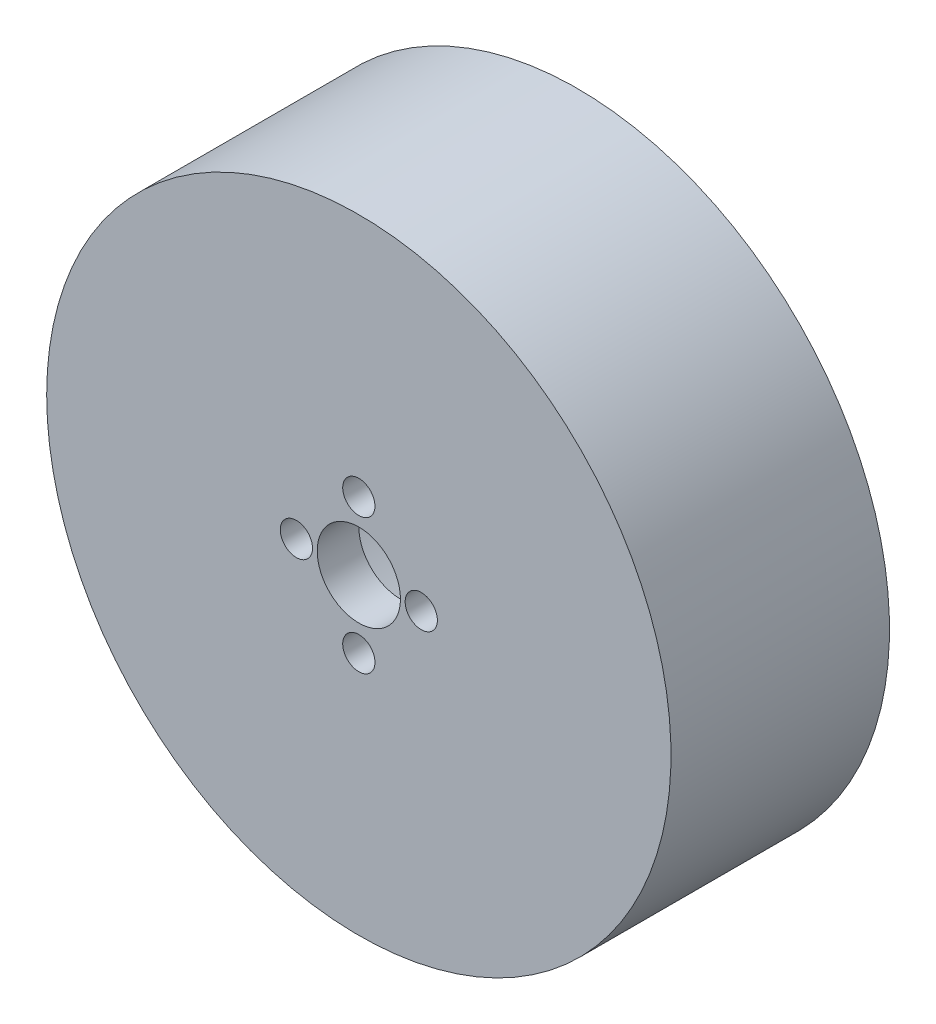
ISO-10303-21;
HEADER;
FILE_DESCRIPTION(('STEP AP214'),'2;1');
FILE_NAME('part.step','',(''),(''),'','','');
FILE_SCHEMA(('AUTOMOTIVE_DESIGN { 1 0 10303 214 1 1 1 1 }'));
ENDSEC;
DATA;
#1=APPLICATION_CONTEXT('core data for automotive mechanical design processes');
#2=APPLICATION_PROTOCOL_DEFINITION('international standard','automotive_design',2000,#1);
#3=PRODUCT_CONTEXT('',#1,'mechanical');
#4=PRODUCT('Part','Part','',(#3));
#5=PRODUCT_RELATED_PRODUCT_CATEGORY('part','',(#4));
#6=PRODUCT_DEFINITION_FORMATION('','',#4);
#7=PRODUCT_DEFINITION_CONTEXT('part definition',#1,'design');
#8=PRODUCT_DEFINITION('design','',#6,#7);
#9=PRODUCT_DEFINITION_SHAPE('','',#8);
#10=(LENGTH_UNIT() NAMED_UNIT(*) SI_UNIT(.MILLI.,.METRE.));
#11=(NAMED_UNIT(*) PLANE_ANGLE_UNIT() SI_UNIT($,.RADIAN.));
#12=(NAMED_UNIT(*) SI_UNIT($,.STERADIAN.) SOLID_ANGLE_UNIT());
#13=UNCERTAINTY_MEASURE_WITH_UNIT(LENGTH_MEASURE(1.E-05),#10,'distance_accuracy_value','');
#14=(GEOMETRIC_REPRESENTATION_CONTEXT(3) GLOBAL_UNCERTAINTY_ASSIGNED_CONTEXT((#13)) GLOBAL_UNIT_ASSIGNED_CONTEXT((#10,
#11,#12)) REPRESENTATION_CONTEXT('',''));
#15=CARTESIAN_POINT('',(0.,0.,0.));
#16=DIRECTION('',(0.,0.,1.));
#17=DIRECTION('',(1.,0.,0.));
#18=AXIS2_PLACEMENT_3D('',#15,#16,#17);
#19=CARTESIAN_POINT('',(0.,0.,0.5));
#20=DIRECTION('',(0.,0.,1.));
#21=DIRECTION('',(1.,0.,0.));
#22=AXIS2_PLACEMENT_3D('',#19,#20,#21);
#23=CYLINDRICAL_SURFACE('',#22,4.);
#24=CARTESIAN_POINT('',(0.,0.,10.5));
#25=DIRECTION('',(0.,0.,1.));
#26=DIRECTION('',(1.,0.,0.));
#27=AXIS2_PLACEMENT_3D('',#24,#25,#26);
#28=CIRCLE('',#27,4.);
#29=CARTESIAN_POINT('',(4.,0.,10.5));
#30=VERTEX_POINT('',#29);
#31=EDGE_CURVE('E58',#30,#30,#28,.T.);
#32=ORIENTED_EDGE('',*,*,#31,.T.);
#33=EDGE_LOOP('',(#32));
#34=FACE_BOUND('',#33,.T.);
#35=CARTESIAN_POINT('',(0.,0.,6.5));
#36=DIRECTION('',(0.,0.,-1.));
#37=DIRECTION('',(-1.,0.,0.));
#38=AXIS2_PLACEMENT_3D('',#35,#36,#37);
#39=CIRCLE('',#38,4.);
#40=CARTESIAN_POINT('',(-4.,0.,6.5));
#41=VERTEX_POINT('',#40);
#42=EDGE_CURVE('E76',#41,#41,#39,.F.);
#43=ORIENTED_EDGE('',*,*,#42,.F.);
#44=EDGE_LOOP('',(#43));
#45=FACE_BOUND('',#44,.T.);
#46=ADVANCED_FACE('F43',(#34,#45),#23,.F.);
#47=CARTESIAN_POINT('',(0.,-6.5,0.5));
#48=DIRECTION('',(0.,0.,1.));
#49=DIRECTION('',(1.,0.,0.));
#50=AXIS2_PLACEMENT_3D('',#47,#48,#49);
#51=CYLINDRICAL_SURFACE('',#50,1.55);
#52=CARTESIAN_POINT('',(0.,-6.5,10.5));
#53=DIRECTION('',(0.,0.,1.));
#54=DIRECTION('',(1.,0.,0.));
#55=AXIS2_PLACEMENT_3D('',#52,#53,#54);
#56=CIRCLE('',#55,1.55);
#57=CARTESIAN_POINT('',(1.55,-6.5,10.5));
#58=VERTEX_POINT('',#57);
#59=EDGE_CURVE('E72',#58,#58,#56,.T.);
#60=ORIENTED_EDGE('',*,*,#59,.T.);
#61=EDGE_LOOP('',(#60));
#62=FACE_BOUND('',#61,.T.);
#63=CARTESIAN_POINT('',(0.,-6.5,6.5));
#64=DIRECTION('',(0.,0.,-1.));
#65=DIRECTION('',(-1.,0.,0.));
#66=AXIS2_PLACEMENT_3D('',#63,#64,#65);
#67=CIRCLE('',#66,1.55);
#68=CARTESIAN_POINT('',(-1.55,-6.5,6.5));
#69=VERTEX_POINT('',#68);
#70=EDGE_CURVE('E83',#69,#69,#67,.F.);
#71=ORIENTED_EDGE('',*,*,#70,.F.);
#72=EDGE_LOOP('',(#71));
#73=FACE_BOUND('',#72,.T.);
#74=ADVANCED_FACE('F128',(#62,#73),#51,.F.);
#75=CARTESIAN_POINT('',(6.,0.,0.5));
#76=DIRECTION('',(0.,0.,1.));
#77=DIRECTION('',(1.,0.,0.));
#78=AXIS2_PLACEMENT_3D('',#75,#76,#77);
#79=CYLINDRICAL_SURFACE('',#78,1.55);
#80=CARTESIAN_POINT('',(6.,0.,10.5));
#81=DIRECTION('',(0.,0.,1.));
#82=DIRECTION('',(1.,0.,0.));
#83=AXIS2_PLACEMENT_3D('',#80,#81,#82);
#84=CIRCLE('',#83,1.55);
#85=CARTESIAN_POINT('',(7.55,0.,10.5));
#86=VERTEX_POINT('',#85);
#87=EDGE_CURVE('E68',#86,#86,#84,.T.);
#88=ORIENTED_EDGE('',*,*,#87,.T.);
#89=EDGE_LOOP('',(#88));
#90=FACE_BOUND('',#89,.T.);
#91=CARTESIAN_POINT('',(6.,0.,6.5));
#92=DIRECTION('',(0.,0.,-1.));
#93=DIRECTION('',(-1.,0.,0.));
#94=AXIS2_PLACEMENT_3D('',#91,#92,#93);
#95=CIRCLE('',#94,1.55);
#96=CARTESIAN_POINT('',(4.45,0.,6.5));
#97=VERTEX_POINT('',#96);
#98=EDGE_CURVE('E87',#97,#97,#95,.F.);
#99=ORIENTED_EDGE('',*,*,#98,.F.);
#100=EDGE_LOOP('',(#99));
#101=FACE_BOUND('',#100,.T.);
#102=ADVANCED_FACE('F123',(#90,#101),#79,.F.);
#103=CARTESIAN_POINT('',(0.,6.5,0.5));
#104=DIRECTION('',(0.,0.,1.));
#105=DIRECTION('',(1.,0.,0.));
#106=AXIS2_PLACEMENT_3D('',#103,#104,#105);
#107=CYLINDRICAL_SURFACE('',#106,1.55);
#108=CARTESIAN_POINT('',(0.,6.5,10.5));
#109=DIRECTION('',(0.,0.,1.));
#110=DIRECTION('',(1.,0.,0.));
#111=AXIS2_PLACEMENT_3D('',#108,#109,#110);
#112=CIRCLE('',#111,1.55);
#113=CARTESIAN_POINT('',(1.55,6.5,10.5));
#114=VERTEX_POINT('',#113);
#115=EDGE_CURVE('E64',#114,#114,#112,.T.);
#116=ORIENTED_EDGE('',*,*,#115,.T.);
#117=EDGE_LOOP('',(#116));
#118=FACE_BOUND('',#117,.T.);
#119=CARTESIAN_POINT('',(0.,6.5,6.5));
#120=DIRECTION('',(0.,0.,-1.));
#121=DIRECTION('',(-1.,0.,0.));
#122=AXIS2_PLACEMENT_3D('',#119,#120,#121);
#123=CIRCLE('',#122,1.55);
#124=CARTESIAN_POINT('',(-1.55,6.5,6.5));
#125=VERTEX_POINT('',#124);
#126=EDGE_CURVE('E91',#125,#125,#123,.F.);
#127=ORIENTED_EDGE('',*,*,#126,.F.);
#128=EDGE_LOOP('',(#127));
#129=FACE_BOUND('',#128,.T.);
#130=ADVANCED_FACE('F113',(#118,#129),#107,.F.);
#131=CARTESIAN_POINT('',(-6.,0.,0.5));
#132=DIRECTION('',(0.,0.,1.));
#133=DIRECTION('',(1.,0.,0.));
#134=AXIS2_PLACEMENT_3D('',#131,#132,#133);
#135=CYLINDRICAL_SURFACE('',#134,1.55);
#136=CARTESIAN_POINT('',(-6.,0.,10.5));
#137=DIRECTION('',(0.,0.,1.));
#138=DIRECTION('',(1.,0.,0.));
#139=AXIS2_PLACEMENT_3D('',#136,#137,#138);
#140=CIRCLE('',#139,1.55);
#141=CARTESIAN_POINT('',(-4.45,0.,10.5));
#142=VERTEX_POINT('',#141);
#143=EDGE_CURVE('E63',#142,#142,#140,.T.);
#144=ORIENTED_EDGE('',*,*,#143,.T.);
#145=EDGE_LOOP('',(#144));
#146=FACE_BOUND('',#145,.T.);
#147=CARTESIAN_POINT('',(-6.,0.,6.5));
#148=DIRECTION('',(0.,0.,-1.));
#149=DIRECTION('',(-1.,0.,0.));
#150=AXIS2_PLACEMENT_3D('',#147,#148,#149);
#151=CIRCLE('',#150,1.55);
#152=CARTESIAN_POINT('',(-7.55,0.,6.5));
#153=VERTEX_POINT('',#152);
#154=EDGE_CURVE('E47',#153,#153,#151,.F.);
#155=ORIENTED_EDGE('',*,*,#154,.F.);
#156=EDGE_LOOP('',(#155));
#157=FACE_BOUND('',#156,.T.);
#158=ADVANCED_FACE('F111',(#146,#157),#135,.F.);
#159=CARTESIAN_POINT('',(0.,0.,10.5));
#160=DIRECTION('',(0.,0.,-1.));
#161=DIRECTION('',(-1.,0.,0.));
#162=AXIS2_PLACEMENT_3D('',#159,#160,#161);
#163=CYLINDRICAL_SURFACE('',#162,30.);
#164=CARTESIAN_POINT('',(0.,0.,10.5));
#165=DIRECTION('',(0.,0.,1.));
#166=DIRECTION('',(1.,0.,0.));
#167=AXIS2_PLACEMENT_3D('',#164,#165,#166);
#168=CIRCLE('',#167,30.);
#169=CARTESIAN_POINT('',(-30.,0.,10.5));
#170=VERTEX_POINT('',#169);
#171=EDGE_CURVE('E10',#170,#170,#168,.T.);
#172=CARTESIAN_POINT('',(0.,0.,-10.5));
#173=DIRECTION('',(0.,0.,1.));
#174=DIRECTION('',(1.,0.,0.));
#175=AXIS2_PLACEMENT_3D('',#172,#173,#174);
#176=CIRCLE('',#175,30.);
#177=CARTESIAN_POINT('',(-30.,0.,-10.5));
#178=VERTEX_POINT('',#177);
#179=EDGE_CURVE('E52',#178,#178,#176,.T.);
#180=CARTESIAN_POINT('',(-30.,0.,10.5));
#181=CARTESIAN_POINT('',(-30.,0.,10.28125));
#182=CARTESIAN_POINT('',(-30.,0.,10.0625));
#183=CARTESIAN_POINT('',(-30.,0.,9.625));
#184=CARTESIAN_POINT('',(-30.,0.,9.40625));
#185=CARTESIAN_POINT('',(-30.,0.,8.96875));
#186=CARTESIAN_POINT('',(-30.,0.,8.75));
#187=CARTESIAN_POINT('',(-30.,0.,8.3125));
#188=CARTESIAN_POINT('',(-30.,0.,8.09375));
#189=CARTESIAN_POINT('',(-30.,0.,7.65625));
#190=CARTESIAN_POINT('',(-30.,0.,7.4375));
#191=CARTESIAN_POINT('',(-30.,0.,7.));
#192=CARTESIAN_POINT('',(-30.,0.,6.78125));
#193=CARTESIAN_POINT('',(-30.,0.,6.34375));
#194=CARTESIAN_POINT('',(-30.,0.,6.125));
#195=CARTESIAN_POINT('',(-30.,0.,5.6875));
#196=CARTESIAN_POINT('',(-30.,0.,5.46875));
#197=CARTESIAN_POINT('',(-30.,0.,5.03125));
#198=CARTESIAN_POINT('',(-30.,0.,4.8125));
#199=CARTESIAN_POINT('',(-30.,0.,4.375));
#200=CARTESIAN_POINT('',(-30.,0.,4.15625));
#201=CARTESIAN_POINT('',(-30.,0.,3.71875));
#202=CARTESIAN_POINT('',(-30.,0.,3.5));
#203=CARTESIAN_POINT('',(-30.,0.,3.0625));
#204=CARTESIAN_POINT('',(-30.,0.,2.84375));
#205=CARTESIAN_POINT('',(-30.,0.,2.40625));
#206=CARTESIAN_POINT('',(-30.,0.,2.1875));
#207=CARTESIAN_POINT('',(-30.,0.,1.75));
#208=CARTESIAN_POINT('',(-30.,0.,1.53125));
#209=CARTESIAN_POINT('',(-30.,0.,1.09375));
#210=CARTESIAN_POINT('',(-30.,0.,0.875000000000001));
#211=CARTESIAN_POINT('',(-30.,0.,0.4375));
#212=CARTESIAN_POINT('',(-30.,0.,0.21875));
#213=CARTESIAN_POINT('',(-30.,0.,-0.21875));
#214=CARTESIAN_POINT('',(-30.,0.,-0.4375));
#215=CARTESIAN_POINT('',(-30.,0.,-0.875000000000001));
#216=CARTESIAN_POINT('',(-30.,0.,-1.09375));
#217=CARTESIAN_POINT('',(-30.,0.,-1.53125));
#218=CARTESIAN_POINT('',(-30.,0.,-1.75));
#219=CARTESIAN_POINT('',(-30.,0.,-2.1875));
#220=CARTESIAN_POINT('',(-30.,0.,-2.40625));
#221=CARTESIAN_POINT('',(-30.,0.,-2.84375));
#222=CARTESIAN_POINT('',(-30.,0.,-3.0625));
#223=CARTESIAN_POINT('',(-30.,0.,-3.5));
#224=CARTESIAN_POINT('',(-30.,0.,-3.71875));
#225=CARTESIAN_POINT('',(-30.,0.,-4.15625));
#226=CARTESIAN_POINT('',(-30.,0.,-4.375));
#227=CARTESIAN_POINT('',(-30.,0.,-4.8125));
#228=CARTESIAN_POINT('',(-30.,0.,-5.03125));
#229=CARTESIAN_POINT('',(-30.,0.,-5.46875));
#230=CARTESIAN_POINT('',(-30.,0.,-5.6875));
#231=CARTESIAN_POINT('',(-30.,0.,-6.125));
#232=CARTESIAN_POINT('',(-30.,0.,-6.34375));
#233=CARTESIAN_POINT('',(-30.,0.,-6.78125));
#234=CARTESIAN_POINT('',(-30.,0.,-7.));
#235=CARTESIAN_POINT('',(-30.,0.,-7.4375));
#236=CARTESIAN_POINT('',(-30.,0.,-7.65625));
#237=CARTESIAN_POINT('',(-30.,0.,-8.09375));
#238=CARTESIAN_POINT('',(-30.,0.,-8.3125));
#239=CARTESIAN_POINT('',(-30.,0.,-8.75));
#240=CARTESIAN_POINT('',(-30.,0.,-8.96875));
#241=CARTESIAN_POINT('',(-30.,0.,-9.40625));
#242=CARTESIAN_POINT('',(-30.,0.,-9.625));
#243=CARTESIAN_POINT('',(-30.,0.,-10.0625));
#244=CARTESIAN_POINT('',(-30.,0.,-10.28125));
#245=CARTESIAN_POINT('',(-30.,0.,-10.5));
#246=B_SPLINE_CURVE_WITH_KNOTS('',3,(#180,#181,#182,#183,#184,#185,#186,#187,#188,#189,#190,
#191,#192,#193,#194,#195,#196,#197,#198,#199,#200,#201,#202,#203,#204,#205,#206,#207,#208,#209,
#210,#211,#212,#213,#214,#215,#216,#217,#218,#219,#220,#221,#222,#223,#224,#225,#226,#227,#228,
#229,#230,#231,#232,#233,#234,#235,#236,#237,#238,#239,#240,#241,#242,#243,#244,#245),
.UNSPECIFIED.,.F.,.F.,(4,2,2,2,2,2,2,2,2,2,2,2,2,2,2,2,2,2,2,2,2,2,2,2,2,2,2,2,2,2,2,2,4),(0.,
0.656250000000001,1.3125,1.96875,2.625,3.28125,3.9375,4.59375,5.25,5.90625,6.5625,7.21875,7.875,
8.53125,9.1875,9.84375,10.5,11.15625,11.8125,12.46875,13.125,13.78125,14.4375,15.09375,15.75,
16.40625,17.0625,17.71875,18.375,19.03125,19.6875,20.34375,21.),.UNSPECIFIED.);
#247=EDGE_CURVE('BSEAM45',#170,#178,#246,.T.);
#248=ORIENTED_EDGE('',*,*,#171,.F.);
#249=ORIENTED_EDGE('',*,*,#179,.T.);
#250=ORIENTED_EDGE('',*,*,#247,.T.);
#251=ORIENTED_EDGE('',*,*,#247,.F.);
#252=EDGE_LOOP('',(#248,#250,#249,#251));
#253=FACE_BOUND('',#252,.T.);
#254=ADVANCED_FACE('F45',(#253),#163,.T.);
#255=CARTESIAN_POINT('',(0.,0.,10.5));
#256=DIRECTION('',(0.,0.,1.));
#257=DIRECTION('',(1.,0.,0.));
#258=AXIS2_PLACEMENT_3D('',#255,#256,#257);
#259=PLANE('',#258);
#260=ORIENTED_EDGE('',*,*,#143,.F.);
#261=EDGE_LOOP('',(#260));
#262=FACE_BOUND('',#261,.T.);
#263=ORIENTED_EDGE('',*,*,#115,.F.);
#264=EDGE_LOOP('',(#263));
#265=FACE_BOUND('',#264,.T.);
#266=ORIENTED_EDGE('',*,*,#87,.F.);
#267=EDGE_LOOP('',(#266));
#268=FACE_BOUND('',#267,.T.);
#269=ORIENTED_EDGE('',*,*,#59,.F.);
#270=EDGE_LOOP('',(#269));
#271=FACE_BOUND('',#270,.T.);
#272=ORIENTED_EDGE('',*,*,#31,.F.);
#273=EDGE_LOOP('',(#272));
#274=FACE_BOUND('',#273,.T.);
#275=ORIENTED_EDGE('',*,*,#171,.T.);
#276=EDGE_LOOP('',(#275));
#277=FACE_BOUND('',#276,.T.);
#278=ADVANCED_FACE('F121',(#262,#265,#268,#271,#274,#277),#259,.T.);
#279=CARTESIAN_POINT('',(0.,0.,-10.5));
#280=DIRECTION('',(0.,0.,1.));
#281=DIRECTION('',(1.,0.,0.));
#282=AXIS2_PLACEMENT_3D('',#279,#280,#281);
#283=PLANE('',#282);
#284=CARTESIAN_POINT('',(0.,0.,-10.5));
#285=DIRECTION('',(0.,0.,-1.));
#286=DIRECTION('',(-1.,0.,0.));
#287=AXIS2_PLACEMENT_3D('',#284,#285,#286);
#288=CIRCLE('',#287,21.);
#289=CARTESIAN_POINT('',(-21.,0.,-10.5));
#290=VERTEX_POINT('',#289);
#291=EDGE_CURVE('E95',#290,#290,#288,.T.);
#292=ORIENTED_EDGE('',*,*,#291,.F.);
#293=EDGE_LOOP('',(#292));
#294=FACE_BOUND('',#293,.T.);
#295=ORIENTED_EDGE('',*,*,#179,.F.);
#296=EDGE_LOOP('',(#295));
#297=FACE_BOUND('',#296,.T.);
#298=ADVANCED_FACE('F138',(#294,#297),#283,.F.);
#299=CARTESIAN_POINT('',(0.,0.,6.5));
#300=DIRECTION('',(0.,0.,-1.));
#301=DIRECTION('',(-1.,0.,0.));
#302=AXIS2_PLACEMENT_3D('',#299,#300,#301);
#303=PLANE('',#302);
#304=CARTESIAN_POINT('',(0.,0.,6.5));
#305=DIRECTION('',(0.,0.,-1.));
#306=DIRECTION('',(-1.,0.,0.));
#307=AXIS2_PLACEMENT_3D('',#304,#305,#306);
#308=CIRCLE('',#307,21.);
#309=CARTESIAN_POINT('',(-21.,0.,6.5));
#310=VERTEX_POINT('',#309);
#311=EDGE_CURVE('E99',#310,#310,#308,.T.);
#312=ORIENTED_EDGE('',*,*,#311,.T.);
#313=EDGE_LOOP('',(#312));
#314=FACE_BOUND('',#313,.T.);
#315=ORIENTED_EDGE('',*,*,#154,.T.);
#316=EDGE_LOOP('',(#315));
#317=FACE_BOUND('',#316,.T.);
#318=ORIENTED_EDGE('',*,*,#126,.T.);
#319=EDGE_LOOP('',(#318));
#320=FACE_BOUND('',#319,.T.);
#321=ORIENTED_EDGE('',*,*,#98,.T.);
#322=EDGE_LOOP('',(#321));
#323=FACE_BOUND('',#322,.T.);
#324=ORIENTED_EDGE('',*,*,#70,.T.);
#325=EDGE_LOOP('',(#324));
#326=FACE_BOUND('',#325,.T.);
#327=ORIENTED_EDGE('',*,*,#42,.T.);
#328=EDGE_LOOP('',(#327));
#329=FACE_BOUND('',#328,.T.);
#330=ADVANCED_FACE('F108',(#314,#317,#320,#323,#326,#329),#303,.T.);
#331=CARTESIAN_POINT('',(0.,0.,6.5));
#332=DIRECTION('',(0.,0.,-1.));
#333=DIRECTION('',(-1.,0.,0.));
#334=AXIS2_PLACEMENT_3D('',#331,#332,#333);
#335=CYLINDRICAL_SURFACE('',#334,21.);
#336=ORIENTED_EDGE('',*,*,#311,.F.);
#337=EDGE_LOOP('',(#336));
#338=FACE_BOUND('',#337,.T.);
#339=ORIENTED_EDGE('',*,*,#291,.T.);
#340=EDGE_LOOP('',(#339));
#341=FACE_BOUND('',#340,.T.);
#342=ADVANCED_FACE('F144',(#338,#341),#335,.F.);
#343=CLOSED_SHELL('',(#46,#74,#102,#130,#158,#254,#278,#298,#330,#342));
#344=MANIFOLD_SOLID_BREP('B2',#343);
#345=ADVANCED_BREP_SHAPE_REPRESENTATION('',(#18,#344),#14);
#346=SHAPE_DEFINITION_REPRESENTATION(#9,#345);
ENDSEC;
END-ISO-10303-21;
